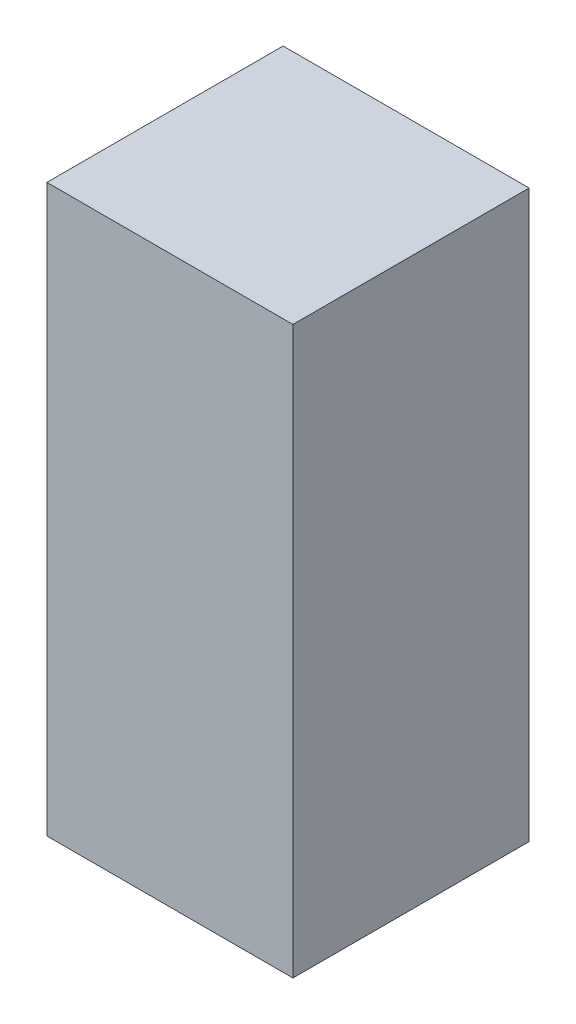
ISO-10303-21;
HEADER;
FILE_DESCRIPTION(('STEP AP214'),'2;1');
FILE_NAME('part.step','',(''),(''),'','','');
FILE_SCHEMA(('AUTOMOTIVE_DESIGN { 1 0 10303 214 1 1 1 1 }'));
ENDSEC;
DATA;
#1=APPLICATION_CONTEXT('core data for automotive mechanical design processes');
#2=APPLICATION_PROTOCOL_DEFINITION('international standard','automotive_design',2000,#1);
#3=PRODUCT_CONTEXT('',#1,'mechanical');
#4=PRODUCT('Part','Part','',(#3));
#5=PRODUCT_RELATED_PRODUCT_CATEGORY('part','',(#4));
#6=PRODUCT_DEFINITION_FORMATION('','',#4);
#7=PRODUCT_DEFINITION_CONTEXT('part definition',#1,'design');
#8=PRODUCT_DEFINITION('design','',#6,#7);
#9=PRODUCT_DEFINITION_SHAPE('','',#8);
#10=(LENGTH_UNIT() NAMED_UNIT(*) SI_UNIT(.MILLI.,.METRE.));
#11=(NAMED_UNIT(*) PLANE_ANGLE_UNIT() SI_UNIT($,.RADIAN.));
#12=(NAMED_UNIT(*) SI_UNIT($,.STERADIAN.) SOLID_ANGLE_UNIT());
#13=UNCERTAINTY_MEASURE_WITH_UNIT(LENGTH_MEASURE(1.E-05),#10,'distance_accuracy_value','');
#14=(GEOMETRIC_REPRESENTATION_CONTEXT(3) GLOBAL_UNCERTAINTY_ASSIGNED_CONTEXT((#13)) GLOBAL_UNIT_ASSIGNED_CONTEXT((#10,
#11,#12)) REPRESENTATION_CONTEXT('',''));
#15=CARTESIAN_POINT('',(0.,0.,0.));
#16=DIRECTION('',(0.,0.,1.));
#17=DIRECTION('',(1.,0.,0.));
#18=AXIS2_PLACEMENT_3D('',#15,#16,#17);
#19=CARTESIAN_POINT('',(24.9936494845361,57.5,48.));
#20=DIRECTION('',(-1.,0.,0.));
#21=DIRECTION('',(0.,0.,1.));
#22=AXIS2_PLACEMENT_3D('',#19,#20,#21);
#23=PLANE('',#22);
#24=DIRECTION('',(0.,1.,0.));
#25=VECTOR('',#24,1.);
#26=CARTESIAN_POINT('',(24.9936494845361,57.5,0.));
#27=LINE('',#26,#25);
#28=CARTESIAN_POINT('',(24.9936494845361,-57.5,0.));
#29=VERTEX_POINT('',#28);
#30=CARTESIAN_POINT('',(24.9936494845361,57.5,0.));
#31=VERTEX_POINT('',#30);
#32=EDGE_CURVE('E102',#29,#31,#27,.T.);
#33=ORIENTED_EDGE('',*,*,#32,.T.);
#34=DIRECTION('',(0.,0.,-1.));
#35=VECTOR('',#34,1.);
#36=CARTESIAN_POINT('',(24.9936494845361,57.5,48.));
#37=LINE('',#36,#35);
#38=CARTESIAN_POINT('',(24.9936494845361,57.5,48.));
#39=VERTEX_POINT('',#38);
#40=EDGE_CURVE('E11',#39,#31,#37,.T.);
#41=ORIENTED_EDGE('',*,*,#40,.F.);
#42=DIRECTION('',(0.,1.,0.));
#43=VECTOR('',#42,1.);
#44=CARTESIAN_POINT('',(24.9936494845361,57.5,48.));
#45=LINE('',#44,#43);
#46=CARTESIAN_POINT('',(24.9936494845361,-57.5,48.));
#47=VERTEX_POINT('',#46);
#48=EDGE_CURVE('E90',#47,#39,#45,.T.);
#49=ORIENTED_EDGE('',*,*,#48,.F.);
#50=DIRECTION('',(0.,0.,-1.));
#51=VECTOR('',#50,1.);
#52=CARTESIAN_POINT('',(24.9936494845361,-57.5,48.));
#53=LINE('',#52,#51);
#54=EDGE_CURVE('E98',#47,#29,#53,.T.);
#55=ORIENTED_EDGE('',*,*,#54,.T.);
#56=EDGE_LOOP('',(#33,#41,#49,#55));
#57=FACE_BOUND('',#56,.T.);
#58=ADVANCED_FACE('F39',(#57),#23,.F.);
#59=CARTESIAN_POINT('',(-24.9936494845361,57.5,48.));
#60=DIRECTION('',(0.,-1.,0.));
#61=DIRECTION('',(0.,0.,-1.));
#62=AXIS2_PLACEMENT_3D('',#59,#60,#61);
#63=PLANE('',#62);
#64=DIRECTION('',(-1.,0.,0.));
#65=VECTOR('',#64,1.);
#66=CARTESIAN_POINT('',(-24.9936494845361,57.5,0.));
#67=LINE('',#66,#65);
#68=CARTESIAN_POINT('',(-24.9936494845361,57.5,0.));
#69=VERTEX_POINT('',#68);
#70=EDGE_CURVE('E94',#31,#69,#67,.T.);
#71=ORIENTED_EDGE('',*,*,#70,.T.);
#72=DIRECTION('',(0.,0.,-1.));
#73=VECTOR('',#72,1.);
#74=CARTESIAN_POINT('',(-24.9936494845361,57.5,48.));
#75=LINE('',#74,#73);
#76=CARTESIAN_POINT('',(-24.9936494845361,57.5,48.));
#77=VERTEX_POINT('',#76);
#78=EDGE_CURVE('E47',#77,#69,#75,.T.);
#79=ORIENTED_EDGE('',*,*,#78,.F.);
#80=DIRECTION('',(-1.,0.,0.));
#81=VECTOR('',#80,1.);
#82=CARTESIAN_POINT('',(-24.9936494845361,57.5,48.));
#83=LINE('',#82,#81);
#84=EDGE_CURVE('E85',#39,#77,#83,.T.);
#85=ORIENTED_EDGE('',*,*,#84,.F.);
#86=ORIENTED_EDGE('',*,*,#40,.T.);
#87=EDGE_LOOP('',(#71,#79,#85,#86));
#88=FACE_BOUND('',#87,.T.);
#89=ADVANCED_FACE('F93',(#88),#63,.F.);
#90=CARTESIAN_POINT('',(-24.9936494845361,57.5,48.));
#91=DIRECTION('',(1.,0.,0.));
#92=DIRECTION('',(0.,0.,-1.));
#93=AXIS2_PLACEMENT_3D('',#90,#91,#92);
#94=PLANE('',#93);
#95=DIRECTION('',(0.,-1.,0.));
#96=VECTOR('',#95,1.);
#97=CARTESIAN_POINT('',(-24.9936494845361,57.5,0.));
#98=LINE('',#97,#96);
#99=CARTESIAN_POINT('',(-24.9936494845361,-57.5,0.));
#100=VERTEX_POINT('',#99);
#101=EDGE_CURVE('E72',#69,#100,#98,.T.);
#102=ORIENTED_EDGE('',*,*,#101,.T.);
#103=DIRECTION('',(0.,0.,-1.));
#104=VECTOR('',#103,1.);
#105=CARTESIAN_POINT('',(-24.9936494845361,-57.5,48.));
#106=LINE('',#105,#104);
#107=CARTESIAN_POINT('',(-24.9936494845361,-57.5,48.));
#108=VERTEX_POINT('',#107);
#109=EDGE_CURVE('E95',#108,#100,#106,.T.);
#110=ORIENTED_EDGE('',*,*,#109,.F.);
#111=DIRECTION('',(0.,-1.,0.));
#112=VECTOR('',#111,1.);
#113=CARTESIAN_POINT('',(-24.9936494845361,57.5,48.));
#114=LINE('',#113,#112);
#115=EDGE_CURVE('E88',#77,#108,#114,.T.);
#116=ORIENTED_EDGE('',*,*,#115,.F.);
#117=ORIENTED_EDGE('',*,*,#78,.T.);
#118=EDGE_LOOP('',(#102,#110,#116,#117));
#119=FACE_BOUND('',#118,.T.);
#120=ADVANCED_FACE('F96',(#119),#94,.F.);
#121=CARTESIAN_POINT('',(-24.9936494845361,-57.5,48.));
#122=DIRECTION('',(0.,1.,0.));
#123=DIRECTION('',(0.,0.,1.));
#124=AXIS2_PLACEMENT_3D('',#121,#122,#123);
#125=PLANE('',#124);
#126=DIRECTION('',(1.,0.,0.));
#127=VECTOR('',#126,1.);
#128=CARTESIAN_POINT('',(-24.9936494845361,-57.5,0.));
#129=LINE('',#128,#127);
#130=EDGE_CURVE('E78',#100,#29,#129,.T.);
#131=ORIENTED_EDGE('',*,*,#130,.T.);
#132=ORIENTED_EDGE('',*,*,#54,.F.);
#133=DIRECTION('',(1.,0.,0.));
#134=VECTOR('',#133,1.);
#135=CARTESIAN_POINT('',(-24.9936494845361,-57.5,48.));
#136=LINE('',#135,#134);
#137=EDGE_CURVE('E55',#108,#47,#136,.T.);
#138=ORIENTED_EDGE('',*,*,#137,.F.);
#139=ORIENTED_EDGE('',*,*,#109,.T.);
#140=EDGE_LOOP('',(#131,#132,#138,#139));
#141=FACE_BOUND('',#140,.T.);
#142=ADVANCED_FACE('F109',(#141),#125,.F.);
#143=CARTESIAN_POINT('',(0.,0.,48.));
#144=DIRECTION('',(0.,0.,1.));
#145=DIRECTION('',(1.,0.,0.));
#146=AXIS2_PLACEMENT_3D('',#143,#144,#145);
#147=PLANE('',#146);
#148=ORIENTED_EDGE('',*,*,#48,.T.);
#149=ORIENTED_EDGE('',*,*,#84,.T.);
#150=ORIENTED_EDGE('',*,*,#115,.T.);
#151=ORIENTED_EDGE('',*,*,#137,.T.);
#152=EDGE_LOOP('',(#148,#149,#150,#151));
#153=FACE_BOUND('',#152,.T.);
#154=ADVANCED_FACE('F86',(#153),#147,.T.);
#155=CARTESIAN_POINT('',(0.,0.,0.));
#156=DIRECTION('',(0.,0.,1.));
#157=DIRECTION('',(1.,0.,0.));
#158=AXIS2_PLACEMENT_3D('',#155,#156,#157);
#159=PLANE('',#158);
#160=ORIENTED_EDGE('',*,*,#32,.F.);
#161=ORIENTED_EDGE('',*,*,#130,.F.);
#162=ORIENTED_EDGE('',*,*,#101,.F.);
#163=ORIENTED_EDGE('',*,*,#70,.F.);
#164=EDGE_LOOP('',(#160,#161,#162,#163));
#165=FACE_BOUND('',#164,.T.);
#166=ADVANCED_FACE('F112',(#165),#159,.F.);
#167=CLOSED_SHELL('',(#58,#89,#120,#142,#154,#166));
#168=MANIFOLD_SOLID_BREP('B2',#167);
#169=ADVANCED_BREP_SHAPE_REPRESENTATION('',(#18,#168),#14);
#170=SHAPE_DEFINITION_REPRESENTATION(#9,#169);
ENDSEC;
END-ISO-10303-21;
